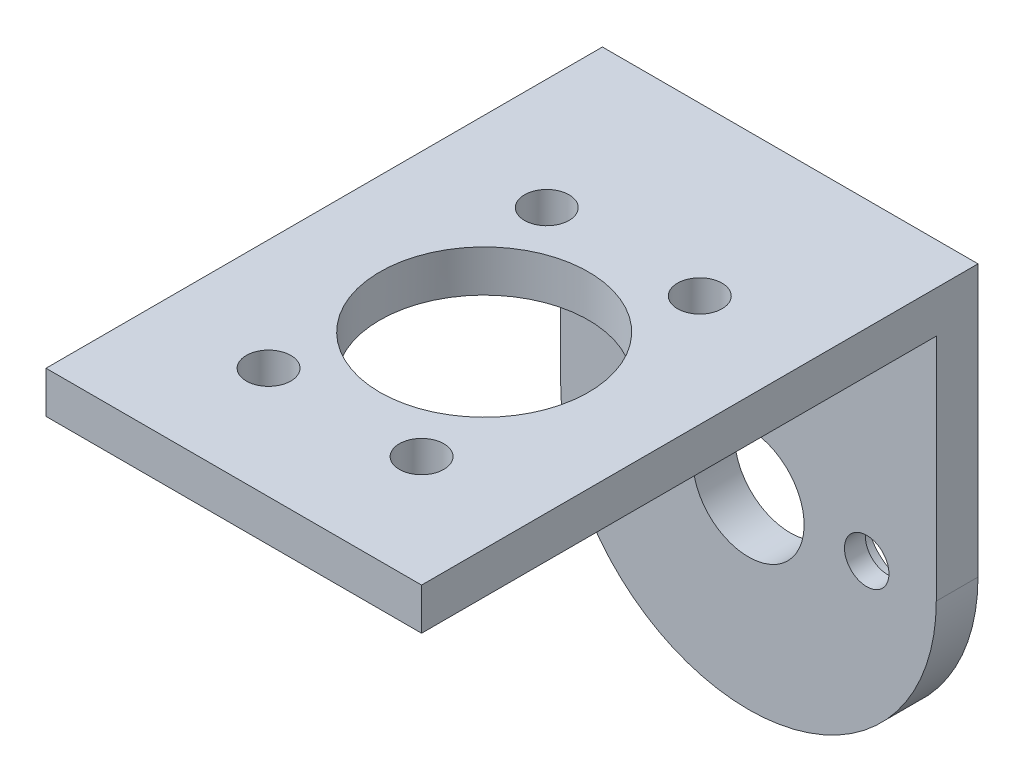
ISO-10303-21;
HEADER;
FILE_DESCRIPTION(('STEP AP214'),'2;1');
FILE_NAME('part.step','',(''),(''),'','','');
FILE_SCHEMA(('AUTOMOTIVE_DESIGN { 1 0 10303 214 1 1 1 1 }'));
ENDSEC;
DATA;
#1=APPLICATION_CONTEXT('core data for automotive mechanical design processes');
#2=APPLICATION_PROTOCOL_DEFINITION('international standard','automotive_design',2000,#1);
#3=PRODUCT_CONTEXT('',#1,'mechanical');
#4=PRODUCT('Part','Part','',(#3));
#5=PRODUCT_RELATED_PRODUCT_CATEGORY('part','',(#4));
#6=PRODUCT_DEFINITION_FORMATION('','',#4);
#7=PRODUCT_DEFINITION_CONTEXT('part definition',#1,'design');
#8=PRODUCT_DEFINITION('design','',#6,#7);
#9=PRODUCT_DEFINITION_SHAPE('','',#8);
#10=(LENGTH_UNIT() NAMED_UNIT(*) SI_UNIT(.MILLI.,.METRE.));
#11=(NAMED_UNIT(*) PLANE_ANGLE_UNIT() SI_UNIT($,.RADIAN.));
#12=(NAMED_UNIT(*) SI_UNIT($,.STERADIAN.) SOLID_ANGLE_UNIT());
#13=UNCERTAINTY_MEASURE_WITH_UNIT(LENGTH_MEASURE(1.E-05),#10,'distance_accuracy_value','');
#14=(GEOMETRIC_REPRESENTATION_CONTEXT(3) GLOBAL_UNCERTAINTY_ASSIGNED_CONTEXT((#13)) GLOBAL_UNIT_ASSIGNED_CONTEXT((#10,
#11,#12)) REPRESENTATION_CONTEXT('',''));
#15=CARTESIAN_POINT('',(0.,0.,0.));
#16=DIRECTION('',(0.,0.,1.));
#17=DIRECTION('',(1.,0.,0.));
#18=AXIS2_PLACEMENT_3D('',#15,#16,#17);
#19=CARTESIAN_POINT('',(2614.76671450499,1592.8264256332,10.));
#20=DIRECTION('',(0.,0.,-1.));
#21=DIRECTION('',(-1.,0.,0.));
#22=AXIS2_PLACEMENT_3D('',#19,#20,#21);
#23=CYLINDRICAL_SURFACE('',#22,1.59999999999993);
#24=CARTESIAN_POINT('',(2614.76671450499,1592.8264256332,3.));
#25=DIRECTION('',(0.,0.,-1.));
#26=DIRECTION('',(0.,1.,0.));
#27=AXIS2_PLACEMENT_3D('',#24,#25,#26);
#28=CIRCLE('',#27,1.59999999999993);
#29=CARTESIAN_POINT('',(2614.76671450499,1594.4264256332,3.));
#30=VERTEX_POINT('',#29);
#31=EDGE_CURVE('E130',#30,#30,#28,.T.);
#32=ORIENTED_EDGE('',*,*,#31,.F.);
#33=EDGE_LOOP('',(#32));
#34=FACE_BOUND('',#33,.T.);
#35=CARTESIAN_POINT('',(2614.76671450499,1592.8264256332,1.5));
#36=DIRECTION('',(0.,0.,-1.));
#37=DIRECTION('',(-1.,0.,0.));
#38=AXIS2_PLACEMENT_3D('',#35,#36,#37);
#39=CIRCLE('',#38,1.59999999999993);
#40=CARTESIAN_POINT('',(2613.16671450499,1592.8264256332,1.5));
#41=VERTEX_POINT('',#40);
#42=EDGE_CURVE('E134',#41,#41,#39,.F.);
#43=ORIENTED_EDGE('',*,*,#42,.F.);
#44=EDGE_LOOP('',(#43));
#45=FACE_BOUND('',#44,.T.);
#46=ADVANCED_FACE('F40',(#34,#45),#23,.F.);
#47=CARTESIAN_POINT('',(2597.76671450499,1592.8264256332,10.));
#48=DIRECTION('',(0.,0.,-1.));
#49=DIRECTION('',(-1.,0.,0.));
#50=AXIS2_PLACEMENT_3D('',#47,#48,#49);
#51=CYLINDRICAL_SURFACE('',#50,1.59999999999993);
#52=CARTESIAN_POINT('',(2597.76671450499,1592.8264256332,3.));
#53=DIRECTION('',(0.,0.,-1.));
#54=DIRECTION('',(0.,1.,0.));
#55=AXIS2_PLACEMENT_3D('',#52,#53,#54);
#56=CIRCLE('',#55,1.59999999999993);
#57=CARTESIAN_POINT('',(2597.76671450499,1594.4264256332,3.));
#58=VERTEX_POINT('',#57);
#59=EDGE_CURVE('E133',#58,#58,#56,.T.);
#60=ORIENTED_EDGE('',*,*,#59,.F.);
#61=EDGE_LOOP('',(#60));
#62=FACE_BOUND('',#61,.T.);
#63=CARTESIAN_POINT('',(2597.76671450499,1592.8264256332,1.5));
#64=DIRECTION('',(0.,0.,-1.));
#65=DIRECTION('',(-1.,0.,0.));
#66=AXIS2_PLACEMENT_3D('',#63,#64,#65);
#67=CIRCLE('',#66,1.59999999999993);
#68=CARTESIAN_POINT('',(2596.16671450499,1592.8264256332,1.5));
#69=VERTEX_POINT('',#68);
#70=EDGE_CURVE('E137',#69,#69,#67,.F.);
#71=ORIENTED_EDGE('',*,*,#70,.F.);
#72=EDGE_LOOP('',(#71));
#73=FACE_BOUND('',#72,.T.);
#74=ADVANCED_FACE('F212',(#62,#73),#51,.F.);
#75=CARTESIAN_POINT('',(2606.26671450499,1592.8264256332,40.));
#76=DIRECTION('',(0.,0.,1.));
#77=DIRECTION('',(1.,0.,0.));
#78=AXIS2_PLACEMENT_3D('',#75,#76,#77);
#79=PLANE('',#78);
#80=DIRECTION('',(1.,0.,0.));
#81=VECTOR('',#80,1.);
#82=CARTESIAN_POINT('',(2579.76671450502,1609.3264256332,40.));
#83=LINE('',#82,#81);
#84=CARTESIAN_POINT('',(2592.76671450499,1609.3264256332,40.));
#85=VERTEX_POINT('',#84);
#86=CARTESIAN_POINT('',(2619.76671450502,1609.3264256332,40.));
#87=VERTEX_POINT('',#86);
#88=EDGE_CURVE('E173',#85,#87,#83,.T.);
#89=ORIENTED_EDGE('',*,*,#88,.T.);
#90=DIRECTION('',(0.,1.,0.));
#91=VECTOR('',#90,1.);
#92=CARTESIAN_POINT('',(2619.76671450499,1592.8264256332,40.));
#93=LINE('',#92,#91);
#94=CARTESIAN_POINT('',(2619.76671450499,1612.3264256332,40.));
#95=VERTEX_POINT('',#94);
#96=EDGE_CURVE('E106',#87,#95,#93,.T.);
#97=ORIENTED_EDGE('',*,*,#96,.T.);
#98=DIRECTION('',(-1.,0.,0.));
#99=VECTOR('',#98,1.);
#100=CARTESIAN_POINT('',(2592.76671450499,1612.3264256332,40.));
#101=LINE('',#100,#99);
#102=CARTESIAN_POINT('',(2592.76671450499,1612.3264256332,40.));
#103=VERTEX_POINT('',#102);
#104=EDGE_CURVE('E66',#95,#103,#101,.T.);
#105=ORIENTED_EDGE('',*,*,#104,.T.);
#106=DIRECTION('',(0.,-1.,0.));
#107=VECTOR('',#106,1.);
#108=CARTESIAN_POINT('',(2592.76671450499,1592.8264256332,40.));
#109=LINE('',#108,#107);
#110=EDGE_CURVE('E97',#103,#85,#109,.T.);
#111=ORIENTED_EDGE('',*,*,#110,.T.);
#112=EDGE_LOOP('',(#89,#97,#105,#111));
#113=FACE_BOUND('',#112,.T.);
#114=ADVANCED_FACE('F178',(#113),#79,.T.);
#115=CARTESIAN_POINT('',(2606.26671450499,1592.8264256332,0.));
#116=DIRECTION('',(0.,0.,1.));
#117=DIRECTION('',(1.,0.,0.));
#118=AXIS2_PLACEMENT_3D('',#115,#116,#117);
#119=PLANE('',#118);
#120=CARTESIAN_POINT('',(2597.76671450499,1592.8264256332,0.));
#121=DIRECTION('',(0.,0.,-1.));
#122=DIRECTION('',(-1.,0.,0.));
#123=AXIS2_PLACEMENT_3D('',#120,#121,#122);
#124=CIRCLE('',#123,3.00000000000015);
#125=CARTESIAN_POINT('',(2594.76671450499,1592.8264256332,0.));
#126=VERTEX_POINT('',#125);
#127=EDGE_CURVE('E163',#126,#126,#124,.T.);
#128=ORIENTED_EDGE('',*,*,#127,.F.);
#129=EDGE_LOOP('',(#128));
#130=FACE_BOUND('',#129,.T.);
#131=CARTESIAN_POINT('',(2614.76671450499,1592.8264256332,0.));
#132=DIRECTION('',(0.,0.,-1.));
#133=DIRECTION('',(-1.,0.,0.));
#134=AXIS2_PLACEMENT_3D('',#131,#132,#133);
#135=CIRCLE('',#134,3.00000000000015);
#136=CARTESIAN_POINT('',(2611.76671450499,1592.8264256332,0.));
#137=VERTEX_POINT('',#136);
#138=EDGE_CURVE('E158',#137,#137,#135,.T.);
#139=ORIENTED_EDGE('',*,*,#138,.F.);
#140=EDGE_LOOP('',(#139));
#141=FACE_BOUND('',#140,.T.);
#142=CARTESIAN_POINT('',(2606.26671450499,1592.8264256332,0.));
#143=DIRECTION('',(0.,0.,-1.));
#144=DIRECTION('',(-1.,0.,0.));
#145=AXIS2_PLACEMENT_3D('',#142,#143,#144);
#146=CIRCLE('',#145,4.00000000000021);
#147=CARTESIAN_POINT('',(2602.26671450499,1592.8264256332,0.));
#148=VERTEX_POINT('',#147);
#149=EDGE_CURVE('E129',#148,#148,#146,.T.);
#150=ORIENTED_EDGE('',*,*,#149,.F.);
#151=EDGE_LOOP('',(#150));
#152=FACE_BOUND('',#151,.T.);
#153=CARTESIAN_POINT('',(2606.26671450499,1592.8264256332,0.));
#154=DIRECTION('',(0.,0.,1.));
#155=DIRECTION('',(1.,0.,0.));
#156=AXIS2_PLACEMENT_3D('',#153,#154,#155);
#157=CIRCLE('',#156,13.5000000000001);
#158=CARTESIAN_POINT('',(2592.76671450499,1592.8264256332,0.));
#159=VERTEX_POINT('',#158);
#160=CARTESIAN_POINT('',(2619.76671450499,1592.8264256332,0.));
#161=VERTEX_POINT('',#160);
#162=EDGE_CURVE('E90',#159,#161,#157,.T.);
#163=ORIENTED_EDGE('',*,*,#162,.F.);
#164=DIRECTION('',(0.,-1.,0.));
#165=VECTOR('',#164,1.);
#166=CARTESIAN_POINT('',(2592.76671450499,1592.8264256332,0.));
#167=LINE('',#166,#165);
#168=CARTESIAN_POINT('',(2592.76671450499,1612.3264256332,0.));
#169=VERTEX_POINT('',#168);
#170=EDGE_CURVE('E101',#169,#159,#167,.T.);
#171=ORIENTED_EDGE('',*,*,#170,.F.);
#172=DIRECTION('',(-1.,0.,0.));
#173=VECTOR('',#172,1.);
#174=CARTESIAN_POINT('',(2592.76671450499,1612.3264256332,0.));
#175=LINE('',#174,#173);
#176=CARTESIAN_POINT('',(2619.76671450499,1612.3264256332,0.));
#177=VERTEX_POINT('',#176);
#178=EDGE_CURVE('E107',#177,#169,#175,.T.);
#179=ORIENTED_EDGE('',*,*,#178,.F.);
#180=DIRECTION('',(0.,1.,0.));
#181=VECTOR('',#180,1.);
#182=CARTESIAN_POINT('',(2619.76671450499,1592.8264256332,0.));
#183=LINE('',#182,#181);
#184=EDGE_CURVE('E111',#161,#177,#183,.T.);
#185=ORIENTED_EDGE('',*,*,#184,.F.);
#186=EDGE_LOOP('',(#163,#171,#179,#185));
#187=FACE_BOUND('',#186,.T.);
#188=ADVANCED_FACE('F110',(#130,#141,#152,#187),#119,.F.);
#189=CARTESIAN_POINT('',(2606.26671450499,1592.8264256332,40.));
#190=DIRECTION('',(0.,0.,-1.));
#191=DIRECTION('',(-1.,0.,0.));
#192=AXIS2_PLACEMENT_3D('',#189,#190,#191);
#193=CYLINDRICAL_SURFACE('',#192,13.5000000000001);
#194=DIRECTION('',(0.,0.,-1.));
#195=VECTOR('',#194,1.);
#196=CARTESIAN_POINT('',(2619.76671450499,1592.8264256332,40.));
#197=LINE('',#196,#195);
#198=CARTESIAN_POINT('',(2619.76671450502,1592.8264256332,3.));
#199=VERTEX_POINT('',#198);
#200=EDGE_CURVE('E49',#199,#161,#197,.T.);
#201=ORIENTED_EDGE('',*,*,#200,.F.);
#202=CARTESIAN_POINT('',(2606.26671450499,1592.8264256332,3.));
#203=DIRECTION('',(0.,0.,-1.));
#204=DIRECTION('',(0.,1.,0.));
#205=AXIS2_PLACEMENT_3D('',#202,#203,#204);
#206=CIRCLE('',#205,13.5000000000001);
#207=CARTESIAN_POINT('',(2592.76671450499,1592.8264256332,3.));
#208=VERTEX_POINT('',#207);
#209=EDGE_CURVE('E93',#199,#208,#206,.T.);
#210=ORIENTED_EDGE('',*,*,#209,.T.);
#211=DIRECTION('',(0.,0.,-1.));
#212=VECTOR('',#211,1.);
#213=CARTESIAN_POINT('',(2592.76671450499,1592.8264256332,40.));
#214=LINE('',#213,#212);
#215=EDGE_CURVE('E86',#208,#159,#214,.T.);
#216=ORIENTED_EDGE('',*,*,#215,.T.);
#217=ORIENTED_EDGE('',*,*,#162,.T.);
#218=EDGE_LOOP('',(#201,#210,#216,#217));
#219=FACE_BOUND('',#218,.T.);
#220=ADVANCED_FACE('F42',(#219),#193,.T.);
#221=CARTESIAN_POINT('',(2619.76671450499,1592.8264256332,40.));
#222=DIRECTION('',(-1.,0.,0.));
#223=DIRECTION('',(0.,0.,1.));
#224=AXIS2_PLACEMENT_3D('',#221,#222,#223);
#225=PLANE('',#224);
#226=ORIENTED_EDGE('',*,*,#96,.F.);
#227=DIRECTION('',(0.,0.,1.));
#228=VECTOR('',#227,1.);
#229=CARTESIAN_POINT('',(2619.76671450502,1609.3264256332,40.));
#230=LINE('',#229,#228);
#231=CARTESIAN_POINT('',(2619.76671450502,1609.3264256332,3.));
#232=VERTEX_POINT('',#231);
#233=EDGE_CURVE('E170',#232,#87,#230,.T.);
#234=ORIENTED_EDGE('',*,*,#233,.F.);
#235=DIRECTION('',(0.,1.,0.));
#236=VECTOR('',#235,1.);
#237=CARTESIAN_POINT('',(2619.76671450502,1609.3264256332,3.));
#238=LINE('',#237,#236);
#239=EDGE_CURVE('E128',#199,#232,#238,.T.);
#240=ORIENTED_EDGE('',*,*,#239,.F.);
#241=ORIENTED_EDGE('',*,*,#200,.T.);
#242=ORIENTED_EDGE('',*,*,#184,.T.);
#243=DIRECTION('',(0.,0.,-1.));
#244=VECTOR('',#243,1.);
#245=CARTESIAN_POINT('',(2619.76671450499,1612.3264256332,40.));
#246=LINE('',#245,#244);
#247=EDGE_CURVE('E121',#95,#177,#246,.T.);
#248=ORIENTED_EDGE('',*,*,#247,.F.);
#249=EDGE_LOOP('',(#226,#234,#240,#241,#242,#248));
#250=FACE_BOUND('',#249,.T.);
#251=ADVANCED_FACE('F190',(#250),#225,.F.);
#252=CARTESIAN_POINT('',(2592.76671450499,1612.3264256332,40.));
#253=DIRECTION('',(0.,-1.,0.));
#254=DIRECTION('',(0.,0.,-1.));
#255=AXIS2_PLACEMENT_3D('',#252,#253,#254);
#256=PLANE('',#255);
#257=CARTESIAN_POINT('',(2606.26671450499,1612.3264256332,22.));
#258=DIRECTION('',(0.,1.,0.));
#259=DIRECTION('',(0.,0.,1.));
#260=AXIS2_PLACEMENT_3D('',#257,#258,#259);
#261=CIRCLE('',#260,7.49999999999995);
#262=CARTESIAN_POINT('',(2606.26671450499,1612.3264256332,29.4999999999999));
#263=VERTEX_POINT('',#262);
#264=EDGE_CURVE('E261',#263,#263,#261,.T.);
#265=ORIENTED_EDGE('',*,*,#264,.F.);
#266=EDGE_LOOP('',(#265));
#267=FACE_BOUND('',#266,.T.);
#268=CARTESIAN_POINT('',(2611.76671450499,1612.3264256332,12.));
#269=DIRECTION('',(0.,1.,0.));
#270=DIRECTION('',(0.,0.,1.));
#271=AXIS2_PLACEMENT_3D('',#268,#269,#270);
#272=CIRCLE('',#271,1.5999999999999);
#273=CARTESIAN_POINT('',(2611.76671450499,1612.3264256332,13.5999999999999));
#274=VERTEX_POINT('',#273);
#275=EDGE_CURVE('E270',#274,#274,#272,.T.);
#276=ORIENTED_EDGE('',*,*,#275,.F.);
#277=EDGE_LOOP('',(#276));
#278=FACE_BOUND('',#277,.T.);
#279=CARTESIAN_POINT('',(2600.76671450499,1612.3264256332,32.));
#280=DIRECTION('',(0.,1.,0.));
#281=DIRECTION('',(0.,0.,1.));
#282=AXIS2_PLACEMENT_3D('',#279,#280,#281);
#283=CIRCLE('',#282,1.5999999999999);
#284=CARTESIAN_POINT('',(2600.76671450499,1612.3264256332,33.5999999999999));
#285=VERTEX_POINT('',#284);
#286=EDGE_CURVE('E266',#285,#285,#283,.T.);
#287=ORIENTED_EDGE('',*,*,#286,.F.);
#288=EDGE_LOOP('',(#287));
#289=FACE_BOUND('',#288,.T.);
#290=CARTESIAN_POINT('',(2611.76671450499,1612.3264256332,32.));
#291=DIRECTION('',(0.,1.,0.));
#292=DIRECTION('',(0.,0.,1.));
#293=AXIS2_PLACEMENT_3D('',#290,#291,#292);
#294=CIRCLE('',#293,1.5999999999999);
#295=CARTESIAN_POINT('',(2611.76671450499,1612.3264256332,33.5999999999999));
#296=VERTEX_POINT('',#295);
#297=EDGE_CURVE('E264',#296,#296,#294,.T.);
#298=ORIENTED_EDGE('',*,*,#297,.F.);
#299=EDGE_LOOP('',(#298));
#300=FACE_BOUND('',#299,.T.);
#301=CARTESIAN_POINT('',(2600.76671450499,1612.3264256332,12.));
#302=DIRECTION('',(0.,1.,0.));
#303=DIRECTION('',(0.,0.,1.));
#304=AXIS2_PLACEMENT_3D('',#301,#302,#303);
#305=CIRCLE('',#304,1.5999999999999);
#306=CARTESIAN_POINT('',(2600.76671450499,1612.3264256332,13.5999999999999));
#307=VERTEX_POINT('',#306);
#308=EDGE_CURVE('E147',#307,#307,#305,.T.);
#309=ORIENTED_EDGE('',*,*,#308,.F.);
#310=EDGE_LOOP('',(#309));
#311=FACE_BOUND('',#310,.T.);
#312=ORIENTED_EDGE('',*,*,#178,.T.);
#313=DIRECTION('',(0.,0.,-1.));
#314=VECTOR('',#313,1.);
#315=CARTESIAN_POINT('',(2592.76671450499,1612.3264256332,40.));
#316=LINE('',#315,#314);
#317=EDGE_CURVE('E96',#103,#169,#316,.T.);
#318=ORIENTED_EDGE('',*,*,#317,.F.);
#319=ORIENTED_EDGE('',*,*,#104,.F.);
#320=ORIENTED_EDGE('',*,*,#247,.T.);
#321=EDGE_LOOP('',(#312,#318,#319,#320));
#322=FACE_BOUND('',#321,.T.);
#323=ADVANCED_FACE('F299',(#267,#278,#289,#300,#311,#322),#256,.F.);
#324=CARTESIAN_POINT('',(2592.76671450499,1592.8264256332,40.));
#325=DIRECTION('',(1.,0.,0.));
#326=DIRECTION('',(0.,0.,-1.));
#327=AXIS2_PLACEMENT_3D('',#324,#325,#326);
#328=PLANE('',#327);
#329=DIRECTION('',(0.,1.,0.));
#330=VECTOR('',#329,1.);
#331=CARTESIAN_POINT('',(2592.76671450499,1592.8264256332,3.));
#332=LINE('',#331,#330);
#333=CARTESIAN_POINT('',(2592.76671450499,1609.3264256332,3.00000000000001));
#334=VERTEX_POINT('',#333);
#335=EDGE_CURVE('E114',#208,#334,#332,.T.);
#336=ORIENTED_EDGE('',*,*,#335,.T.);
#337=DIRECTION('',(0.,0.,1.));
#338=VECTOR('',#337,1.);
#339=CARTESIAN_POINT('',(2592.76671450499,1609.3264256332,40.));
#340=LINE('',#339,#338);
#341=EDGE_CURVE('E11',#334,#85,#340,.T.);
#342=ORIENTED_EDGE('',*,*,#341,.T.);
#343=ORIENTED_EDGE('',*,*,#110,.F.);
#344=ORIENTED_EDGE('',*,*,#317,.T.);
#345=ORIENTED_EDGE('',*,*,#170,.T.);
#346=ORIENTED_EDGE('',*,*,#215,.F.);
#347=EDGE_LOOP('',(#336,#342,#343,#344,#345,#346));
#348=FACE_BOUND('',#347,.T.);
#349=ADVANCED_FACE('F102',(#348),#328,.F.);
#350=CARTESIAN_POINT('',(2579.76671450502,1609.3264256332,40.));
#351=DIRECTION('',(0.,1.,0.));
#352=DIRECTION('',(-1.,0.,0.));
#353=AXIS2_PLACEMENT_3D('',#350,#351,#352);
#354=PLANE('',#353);
#355=CARTESIAN_POINT('',(2606.26671450499,1609.3264256332,22.));
#356=DIRECTION('',(0.,1.,0.));
#357=DIRECTION('',(-1.,0.,0.));
#358=AXIS2_PLACEMENT_3D('',#355,#356,#357);
#359=CIRCLE('',#358,7.49999999999995);
#360=CARTESIAN_POINT('',(2598.76671450499,1609.3264256332,22.));
#361=VERTEX_POINT('',#360);
#362=EDGE_CURVE('E44',#361,#361,#359,.T.);
#363=ORIENTED_EDGE('',*,*,#362,.T.);
#364=EDGE_LOOP('',(#363));
#365=FACE_BOUND('',#364,.T.);
#366=CARTESIAN_POINT('',(2611.76671450499,1609.3264256332,12.));
#367=DIRECTION('',(0.,1.,0.));
#368=DIRECTION('',(-1.,0.,0.));
#369=AXIS2_PLACEMENT_3D('',#366,#367,#368);
#370=CIRCLE('',#369,1.5999999999999);
#371=CARTESIAN_POINT('',(2610.16671450499,1609.3264256332,12.));
#372=VERTEX_POINT('',#371);
#373=EDGE_CURVE('E152',#372,#372,#370,.T.);
#374=ORIENTED_EDGE('',*,*,#373,.T.);
#375=EDGE_LOOP('',(#374));
#376=FACE_BOUND('',#375,.T.);
#377=CARTESIAN_POINT('',(2600.76671450499,1609.3264256332,32.));
#378=DIRECTION('',(0.,1.,0.));
#379=DIRECTION('',(-1.,0.,0.));
#380=AXIS2_PLACEMENT_3D('',#377,#378,#379);
#381=CIRCLE('',#380,1.5999999999999);
#382=CARTESIAN_POINT('',(2599.16671450499,1609.3264256332,32.));
#383=VERTEX_POINT('',#382);
#384=EDGE_CURVE('E150',#383,#383,#381,.T.);
#385=ORIENTED_EDGE('',*,*,#384,.T.);
#386=EDGE_LOOP('',(#385));
#387=FACE_BOUND('',#386,.T.);
#388=CARTESIAN_POINT('',(2611.76671450499,1609.3264256332,32.));
#389=DIRECTION('',(0.,1.,0.));
#390=DIRECTION('',(-1.,0.,0.));
#391=AXIS2_PLACEMENT_3D('',#388,#389,#390);
#392=CIRCLE('',#391,1.5999999999999);
#393=CARTESIAN_POINT('',(2610.16671450499,1609.3264256332,32.));
#394=VERTEX_POINT('',#393);
#395=EDGE_CURVE('E146',#394,#394,#392,.T.);
#396=ORIENTED_EDGE('',*,*,#395,.T.);
#397=EDGE_LOOP('',(#396));
#398=FACE_BOUND('',#397,.T.);
#399=CARTESIAN_POINT('',(2600.76671450499,1609.3264256332,12.));
#400=DIRECTION('',(0.,1.,0.));
#401=DIRECTION('',(-1.,0.,0.));
#402=AXIS2_PLACEMENT_3D('',#399,#400,#401);
#403=CIRCLE('',#402,1.5999999999999);
#404=CARTESIAN_POINT('',(2599.16671450499,1609.3264256332,12.));
#405=VERTEX_POINT('',#404);
#406=EDGE_CURVE('E143',#405,#405,#403,.T.);
#407=ORIENTED_EDGE('',*,*,#406,.T.);
#408=EDGE_LOOP('',(#407));
#409=FACE_BOUND('',#408,.T.);
#410=DIRECTION('',(1.,0.,0.));
#411=VECTOR('',#410,1.);
#412=CARTESIAN_POINT('',(2579.76671450502,1609.3264256332,3.));
#413=LINE('',#412,#411);
#414=EDGE_CURVE('E57',#334,#232,#413,.T.);
#415=ORIENTED_EDGE('',*,*,#414,.T.);
#416=ORIENTED_EDGE('',*,*,#233,.T.);
#417=ORIENTED_EDGE('',*,*,#88,.F.);
#418=ORIENTED_EDGE('',*,*,#341,.F.);
#419=EDGE_LOOP('',(#415,#416,#417,#418));
#420=FACE_BOUND('',#419,.T.);
#421=ADVANCED_FACE('F183',(#365,#376,#387,#398,#409,#420),#354,.F.);
#422=CARTESIAN_POINT('',(2579.76671450502,1609.3264256332,3.));
#423=DIRECTION('',(0.,0.,-1.));
#424=DIRECTION('',(0.,1.,0.));
#425=AXIS2_PLACEMENT_3D('',#422,#423,#424);
#426=PLANE('',#425);
#427=ORIENTED_EDGE('',*,*,#59,.T.);
#428=EDGE_LOOP('',(#427));
#429=FACE_BOUND('',#428,.T.);
#430=ORIENTED_EDGE('',*,*,#31,.T.);
#431=EDGE_LOOP('',(#430));
#432=FACE_BOUND('',#431,.T.);
#433=CARTESIAN_POINT('',(2606.26671450499,1592.8264256332,3.));
#434=DIRECTION('',(0.,0.,-1.));
#435=DIRECTION('',(0.,1.,0.));
#436=AXIS2_PLACEMENT_3D('',#433,#434,#435);
#437=CIRCLE('',#436,4.00000000000021);
#438=CARTESIAN_POINT('',(2606.26671450499,1596.8264256332,3.));
#439=VERTEX_POINT('',#438);
#440=EDGE_CURVE('E125',#439,#439,#437,.T.);
#441=ORIENTED_EDGE('',*,*,#440,.T.);
#442=EDGE_LOOP('',(#441));
#443=FACE_BOUND('',#442,.T.);
#444=ORIENTED_EDGE('',*,*,#239,.T.);
#445=ORIENTED_EDGE('',*,*,#414,.F.);
#446=ORIENTED_EDGE('',*,*,#335,.F.);
#447=ORIENTED_EDGE('',*,*,#209,.F.);
#448=EDGE_LOOP('',(#444,#445,#446,#447));
#449=FACE_BOUND('',#448,.T.);
#450=ADVANCED_FACE('F195',(#429,#432,#443,#449),#426,.F.);
#451=CARTESIAN_POINT('',(2606.26671450499,1592.8264256332,10.));
#452=DIRECTION('',(0.,0.,-1.));
#453=DIRECTION('',(-1.,0.,0.));
#454=AXIS2_PLACEMENT_3D('',#451,#452,#453);
#455=CYLINDRICAL_SURFACE('',#454,4.00000000000021);
#456=ORIENTED_EDGE('',*,*,#149,.T.);
#457=EDGE_LOOP('',(#456));
#458=FACE_BOUND('',#457,.T.);
#459=ORIENTED_EDGE('',*,*,#440,.F.);
#460=EDGE_LOOP('',(#459));
#461=FACE_BOUND('',#460,.T.);
#462=ADVANCED_FACE('F197',(#458,#461),#455,.F.);
#463=CARTESIAN_POINT('',(2597.76671450499,1592.8264256332,1.5));
#464=DIRECTION('',(0.,0.,-1.));
#465=DIRECTION('',(-1.,0.,0.));
#466=AXIS2_PLACEMENT_3D('',#463,#464,#465);
#467=PLANE('',#466);
#468=CARTESIAN_POINT('',(2597.76671450499,1592.8264256332,1.5));
#469=DIRECTION('',(0.,0.,-1.));
#470=DIRECTION('',(-1.,0.,0.));
#471=AXIS2_PLACEMENT_3D('',#468,#469,#470);
#472=CIRCLE('',#471,3.00000000000015);
#473=CARTESIAN_POINT('',(2594.76671450499,1592.8264256332,1.5));
#474=VERTEX_POINT('',#473);
#475=EDGE_CURVE('E140',#474,#474,#472,.T.);
#476=ORIENTED_EDGE('',*,*,#475,.T.);
#477=EDGE_LOOP('',(#476));
#478=FACE_BOUND('',#477,.T.);
#479=ORIENTED_EDGE('',*,*,#70,.T.);
#480=EDGE_LOOP('',(#479));
#481=FACE_BOUND('',#480,.T.);
#482=ADVANCED_FACE('F204',(#478,#481),#467,.T.);
#483=CARTESIAN_POINT('',(2597.76671450499,1592.8264256332,1.5));
#484=DIRECTION('',(0.,0.,-1.));
#485=DIRECTION('',(-1.,0.,0.));
#486=AXIS2_PLACEMENT_3D('',#483,#484,#485);
#487=CYLINDRICAL_SURFACE('',#486,3.00000000000015);
#488=ORIENTED_EDGE('',*,*,#475,.F.);
#489=EDGE_LOOP('',(#488));
#490=FACE_BOUND('',#489,.T.);
#491=ORIENTED_EDGE('',*,*,#127,.T.);
#492=EDGE_LOOP('',(#491));
#493=FACE_BOUND('',#492,.T.);
#494=ADVANCED_FACE('F227',(#490,#493),#487,.F.);
#495=CARTESIAN_POINT('',(2614.76671450499,1592.8264256332,1.5));
#496=DIRECTION('',(0.,0.,-1.));
#497=DIRECTION('',(-1.,0.,0.));
#498=AXIS2_PLACEMENT_3D('',#495,#496,#497);
#499=PLANE('',#498);
#500=CARTESIAN_POINT('',(2614.76671450499,1592.8264256332,1.5));
#501=DIRECTION('',(0.,0.,-1.));
#502=DIRECTION('',(-1.,0.,0.));
#503=AXIS2_PLACEMENT_3D('',#500,#501,#502);
#504=CIRCLE('',#503,3.00000000000015);
#505=CARTESIAN_POINT('',(2611.76671450499,1592.8264256332,1.5));
#506=VERTEX_POINT('',#505);
#507=EDGE_CURVE('E154',#506,#506,#504,.T.);
#508=ORIENTED_EDGE('',*,*,#507,.T.);
#509=EDGE_LOOP('',(#508));
#510=FACE_BOUND('',#509,.T.);
#511=ORIENTED_EDGE('',*,*,#42,.T.);
#512=EDGE_LOOP('',(#511));
#513=FACE_BOUND('',#512,.T.);
#514=ADVANCED_FACE('F223',(#510,#513),#499,.T.);
#515=CARTESIAN_POINT('',(2614.76671450499,1592.8264256332,1.5));
#516=DIRECTION('',(0.,0.,-1.));
#517=DIRECTION('',(-1.,0.,0.));
#518=AXIS2_PLACEMENT_3D('',#515,#516,#517);
#519=CYLINDRICAL_SURFACE('',#518,3.00000000000015);
#520=ORIENTED_EDGE('',*,*,#507,.F.);
#521=EDGE_LOOP('',(#520));
#522=FACE_BOUND('',#521,.T.);
#523=ORIENTED_EDGE('',*,*,#138,.T.);
#524=EDGE_LOOP('',(#523));
#525=FACE_BOUND('',#524,.T.);
#526=ADVANCED_FACE('F226',(#522,#525),#519,.F.);
#527=CARTESIAN_POINT('',(2600.76671450499,1602.3264256332,12.));
#528=DIRECTION('',(0.,1.,0.));
#529=DIRECTION('',(0.,0.,1.));
#530=AXIS2_PLACEMENT_3D('',#527,#528,#529);
#531=CYLINDRICAL_SURFACE('',#530,1.5999999999999);
#532=ORIENTED_EDGE('',*,*,#308,.T.);
#533=EDGE_LOOP('',(#532));
#534=FACE_BOUND('',#533,.T.);
#535=ORIENTED_EDGE('',*,*,#406,.F.);
#536=EDGE_LOOP('',(#535));
#537=FACE_BOUND('',#536,.T.);
#538=ADVANCED_FACE('F230',(#534,#537),#531,.F.);
#539=CARTESIAN_POINT('',(2611.76671450499,1602.3264256332,32.));
#540=DIRECTION('',(0.,1.,0.));
#541=DIRECTION('',(0.,0.,1.));
#542=AXIS2_PLACEMENT_3D('',#539,#540,#541);
#543=CYLINDRICAL_SURFACE('',#542,1.5999999999999);
#544=ORIENTED_EDGE('',*,*,#297,.T.);
#545=EDGE_LOOP('',(#544));
#546=FACE_BOUND('',#545,.T.);
#547=ORIENTED_EDGE('',*,*,#395,.F.);
#548=EDGE_LOOP('',(#547));
#549=FACE_BOUND('',#548,.T.);
#550=ADVANCED_FACE('F240',(#546,#549),#543,.F.);
#551=CARTESIAN_POINT('',(2600.76671450499,1602.3264256332,32.));
#552=DIRECTION('',(0.,1.,0.));
#553=DIRECTION('',(0.,0.,1.));
#554=AXIS2_PLACEMENT_3D('',#551,#552,#553);
#555=CYLINDRICAL_SURFACE('',#554,1.5999999999999);
#556=ORIENTED_EDGE('',*,*,#286,.T.);
#557=EDGE_LOOP('',(#556));
#558=FACE_BOUND('',#557,.T.);
#559=ORIENTED_EDGE('',*,*,#384,.F.);
#560=EDGE_LOOP('',(#559));
#561=FACE_BOUND('',#560,.T.);
#562=ADVANCED_FACE('F242',(#558,#561),#555,.F.);
#563=CARTESIAN_POINT('',(2611.76671450499,1602.3264256332,12.));
#564=DIRECTION('',(0.,1.,0.));
#565=DIRECTION('',(0.,0.,1.));
#566=AXIS2_PLACEMENT_3D('',#563,#564,#565);
#567=CYLINDRICAL_SURFACE('',#566,1.5999999999999);
#568=ORIENTED_EDGE('',*,*,#275,.T.);
#569=EDGE_LOOP('',(#568));
#570=FACE_BOUND('',#569,.T.);
#571=ORIENTED_EDGE('',*,*,#373,.F.);
#572=EDGE_LOOP('',(#571));
#573=FACE_BOUND('',#572,.T.);
#574=ADVANCED_FACE('F245',(#570,#573),#567,.F.);
#575=CARTESIAN_POINT('',(2606.26671450499,1602.3264256332,22.));
#576=DIRECTION('',(0.,1.,0.));
#577=DIRECTION('',(0.,0.,1.));
#578=AXIS2_PLACEMENT_3D('',#575,#576,#577);
#579=CYLINDRICAL_SURFACE('',#578,7.49999999999995);
#580=ORIENTED_EDGE('',*,*,#264,.T.);
#581=EDGE_LOOP('',(#580));
#582=FACE_BOUND('',#581,.T.);
#583=ORIENTED_EDGE('',*,*,#362,.F.);
#584=EDGE_LOOP('',(#583));
#585=FACE_BOUND('',#584,.T.);
#586=ADVANCED_FACE('F249',(#582,#585),#579,.F.);
#587=CLOSED_SHELL('',(#46,#74,#114,#188,#220,#251,#323,#349,#421,#450,#462,#482,#494,#514,#526,
#538,#550,#562,#574,#586));
#588=MANIFOLD_SOLID_BREP('B2',#587);
#589=ADVANCED_BREP_SHAPE_REPRESENTATION('',(#18,#588),#14);
#590=SHAPE_DEFINITION_REPRESENTATION(#9,#589);
ENDSEC;
END-ISO-10303-21;
